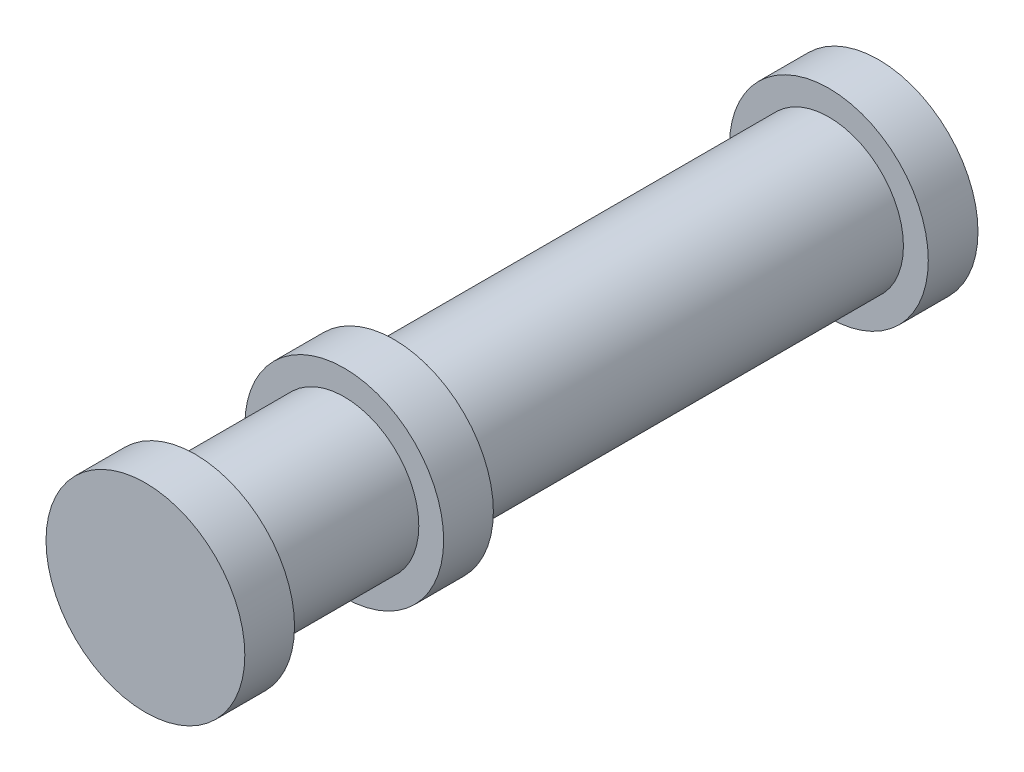
ISO-10303-21;
HEADER;
FILE_DESCRIPTION(('STEP AP214'),'2;1');
FILE_NAME('part.step','',(''),(''),'','','');
FILE_SCHEMA(('AUTOMOTIVE_DESIGN { 1 0 10303 214 1 1 1 1 }'));
ENDSEC;
DATA;
#1=APPLICATION_CONTEXT('core data for automotive mechanical design processes');
#2=APPLICATION_PROTOCOL_DEFINITION('international standard','automotive_design',2000,#1);
#3=PRODUCT_CONTEXT('',#1,'mechanical');
#4=PRODUCT('Part','Part','',(#3));
#5=PRODUCT_RELATED_PRODUCT_CATEGORY('part','',(#4));
#6=PRODUCT_DEFINITION_FORMATION('','',#4);
#7=PRODUCT_DEFINITION_CONTEXT('part definition',#1,'design');
#8=PRODUCT_DEFINITION('design','',#6,#7);
#9=PRODUCT_DEFINITION_SHAPE('','',#8);
#10=(LENGTH_UNIT() NAMED_UNIT(*) SI_UNIT(.MILLI.,.METRE.));
#11=(NAMED_UNIT(*) PLANE_ANGLE_UNIT() SI_UNIT($,.RADIAN.));
#12=(NAMED_UNIT(*) SI_UNIT($,.STERADIAN.) SOLID_ANGLE_UNIT());
#13=UNCERTAINTY_MEASURE_WITH_UNIT(LENGTH_MEASURE(1.E-05),#10,'distance_accuracy_value','');
#14=(GEOMETRIC_REPRESENTATION_CONTEXT(3) GLOBAL_UNCERTAINTY_ASSIGNED_CONTEXT((#13)) GLOBAL_UNIT_ASSIGNED_CONTEXT((#10,
#11,#12)) REPRESENTATION_CONTEXT('',''));
#15=CARTESIAN_POINT('',(0.,0.,0.));
#16=DIRECTION('',(0.,0.,1.));
#17=DIRECTION('',(1.,0.,0.));
#18=AXIS2_PLACEMENT_3D('',#15,#16,#17);
#19=CARTESIAN_POINT('',(0.,0.,39.5));
#20=DIRECTION('',(0.,0.,-1.));
#21=DIRECTION('',(-1.,0.,0.));
#22=AXIS2_PLACEMENT_3D('',#19,#20,#21);
#23=CYLINDRICAL_SURFACE('',#22,3.);
#24=CARTESIAN_POINT('',(0.,0.,19.5));
#25=DIRECTION('',(0.,0.,1.));
#26=DIRECTION('',(1.,0.,0.));
#27=AXIS2_PLACEMENT_3D('',#24,#25,#26);
#28=CIRCLE('',#27,3.);
#29=CARTESIAN_POINT('',(3.,0.,19.5));
#30=VERTEX_POINT('',#29);
#31=EDGE_CURVE('E10',#30,#30,#28,.T.);
#32=ORIENTED_EDGE('',*,*,#31,.T.);
#33=EDGE_LOOP('',(#32));
#34=FACE_BOUND('',#33,.T.);
#35=CARTESIAN_POINT('',(0.,0.,25.5));
#36=DIRECTION('',(0.,0.,1.));
#37=DIRECTION('',(1.,0.,0.));
#38=AXIS2_PLACEMENT_3D('',#35,#36,#37);
#39=CIRCLE('',#38,3.);
#40=CARTESIAN_POINT('',(3.,0.,25.5));
#41=VERTEX_POINT('',#40);
#42=EDGE_CURVE('E40',#41,#41,#39,.T.);
#43=ORIENTED_EDGE('',*,*,#42,.F.);
#44=EDGE_LOOP('',(#43));
#45=FACE_BOUND('',#44,.T.);
#46=ADVANCED_FACE('F36',(#34,#45),#23,.T.);
#47=CARTESIAN_POINT('',(0.,0.,17.5));
#48=DIRECTION('',(0.,0.,-1.));
#49=DIRECTION('',(-1.,0.,0.));
#50=AXIS2_PLACEMENT_3D('',#47,#48,#49);
#51=CYLINDRICAL_SURFACE('',#50,3.);
#52=CARTESIAN_POINT('',(0.,0.,17.5));
#53=DIRECTION('',(0.,0.,1.));
#54=DIRECTION('',(1.,0.,0.));
#55=AXIS2_PLACEMENT_3D('',#52,#53,#54);
#56=CIRCLE('',#55,3.);
#57=CARTESIAN_POINT('',(3.,0.,17.5));
#58=VERTEX_POINT('',#57);
#59=EDGE_CURVE('E44',#58,#58,#56,.T.);
#60=ORIENTED_EDGE('',*,*,#59,.F.);
#61=EDGE_LOOP('',(#60));
#62=FACE_BOUND('',#61,.T.);
#63=CARTESIAN_POINT('',(0.,0.,0.));
#64=DIRECTION('',(0.,0.,1.));
#65=DIRECTION('',(1.,0.,0.));
#66=AXIS2_PLACEMENT_3D('',#63,#64,#65);
#67=CIRCLE('',#66,3.);
#68=CARTESIAN_POINT('',(3.,0.,0.));
#69=VERTEX_POINT('',#68);
#70=EDGE_CURVE('E49',#69,#69,#67,.T.);
#71=ORIENTED_EDGE('',*,*,#70,.T.);
#72=EDGE_LOOP('',(#71));
#73=FACE_BOUND('',#72,.T.);
#74=ADVANCED_FACE('F38',(#62,#73),#51,.T.);
#75=CARTESIAN_POINT('',(0.,0.,-2.));
#76=DIRECTION('',(0.,0.,1.));
#77=DIRECTION('',(1.,0.,0.));
#78=AXIS2_PLACEMENT_3D('',#75,#76,#77);
#79=CYLINDRICAL_SURFACE('',#78,4.);
#80=CARTESIAN_POINT('',(0.,0.,-2.));
#81=DIRECTION('',(0.,0.,-1.));
#82=DIRECTION('',(-1.,0.,0.));
#83=AXIS2_PLACEMENT_3D('',#80,#81,#82);
#84=CIRCLE('',#83,4.);
#85=CARTESIAN_POINT('',(-4.,0.,-2.));
#86=VERTEX_POINT('',#85);
#87=EDGE_CURVE('E62',#86,#86,#84,.T.);
#88=ORIENTED_EDGE('',*,*,#87,.F.);
#89=EDGE_LOOP('',(#88));
#90=FACE_BOUND('',#89,.T.);
#91=CARTESIAN_POINT('',(0.,0.,0.));
#92=DIRECTION('',(0.,0.,-1.));
#93=DIRECTION('',(-1.,0.,0.));
#94=AXIS2_PLACEMENT_3D('',#91,#92,#93);
#95=CIRCLE('',#94,4.);
#96=CARTESIAN_POINT('',(-4.,0.,0.));
#97=VERTEX_POINT('',#96);
#98=EDGE_CURVE('E58',#97,#97,#95,.T.);
#99=ORIENTED_EDGE('',*,*,#98,.T.);
#100=EDGE_LOOP('',(#99));
#101=FACE_BOUND('',#100,.T.);
#102=ADVANCED_FACE('F78',(#90,#101),#79,.T.);
#103=CARTESIAN_POINT('',(0.,0.,-2.));
#104=DIRECTION('',(0.,0.,-1.));
#105=DIRECTION('',(-1.,0.,0.));
#106=AXIS2_PLACEMENT_3D('',#103,#104,#105);
#107=PLANE('',#106);
#108=ORIENTED_EDGE('',*,*,#87,.T.);
#109=EDGE_LOOP('',(#108));
#110=FACE_BOUND('',#109,.T.);
#111=ADVANCED_FACE('F74',(#110),#107,.T.);
#112=CARTESIAN_POINT('',(0.,0.,0.));
#113=DIRECTION('',(0.,0.,-1.));
#114=DIRECTION('',(-1.,0.,0.));
#115=AXIS2_PLACEMENT_3D('',#112,#113,#114);
#116=PLANE('',#115);
#117=ORIENTED_EDGE('',*,*,#70,.F.);
#118=EDGE_LOOP('',(#117));
#119=FACE_BOUND('',#118,.T.);
#120=ORIENTED_EDGE('',*,*,#98,.F.);
#121=EDGE_LOOP('',(#120));
#122=FACE_BOUND('',#121,.T.);
#123=ADVANCED_FACE('F70',(#119,#122),#116,.F.);
#124=CARTESIAN_POINT('',(0.,0.,19.5));
#125=DIRECTION('',(0.,0.,-1.));
#126=DIRECTION('',(-1.,0.,0.));
#127=AXIS2_PLACEMENT_3D('',#124,#125,#126);
#128=CYLINDRICAL_SURFACE('',#127,4.);
#129=CARTESIAN_POINT('',(0.,0.,19.5));
#130=DIRECTION('',(0.,0.,1.));
#131=DIRECTION('',(1.,0.,0.));
#132=AXIS2_PLACEMENT_3D('',#129,#130,#131);
#133=CIRCLE('',#132,4.);
#134=CARTESIAN_POINT('',(4.,0.,19.5));
#135=VERTEX_POINT('',#134);
#136=EDGE_CURVE('E55',#135,#135,#133,.T.);
#137=ORIENTED_EDGE('',*,*,#136,.F.);
#138=EDGE_LOOP('',(#137));
#139=FACE_BOUND('',#138,.T.);
#140=CARTESIAN_POINT('',(0.,0.,17.5));
#141=DIRECTION('',(0.,0.,1.));
#142=DIRECTION('',(1.,0.,0.));
#143=AXIS2_PLACEMENT_3D('',#140,#141,#142);
#144=CIRCLE('',#143,4.);
#145=CARTESIAN_POINT('',(4.,0.,17.5));
#146=VERTEX_POINT('',#145);
#147=EDGE_CURVE('E59',#146,#146,#144,.T.);
#148=ORIENTED_EDGE('',*,*,#147,.T.);
#149=EDGE_LOOP('',(#148));
#150=FACE_BOUND('',#149,.T.);
#151=ADVANCED_FACE('F73',(#139,#150),#128,.T.);
#152=CARTESIAN_POINT('',(0.,0.,19.5));
#153=DIRECTION('',(0.,0.,1.));
#154=DIRECTION('',(1.,0.,0.));
#155=AXIS2_PLACEMENT_3D('',#152,#153,#154);
#156=PLANE('',#155);
#157=ORIENTED_EDGE('',*,*,#31,.F.);
#158=EDGE_LOOP('',(#157));
#159=FACE_BOUND('',#158,.T.);
#160=ORIENTED_EDGE('',*,*,#136,.T.);
#161=EDGE_LOOP('',(#160));
#162=FACE_BOUND('',#161,.T.);
#163=ADVANCED_FACE('F98',(#159,#162),#156,.T.);
#164=CARTESIAN_POINT('',(0.,0.,17.5));
#165=DIRECTION('',(0.,0.,1.));
#166=DIRECTION('',(1.,0.,0.));
#167=AXIS2_PLACEMENT_3D('',#164,#165,#166);
#168=PLANE('',#167);
#169=ORIENTED_EDGE('',*,*,#59,.T.);
#170=EDGE_LOOP('',(#169));
#171=FACE_BOUND('',#170,.T.);
#172=ORIENTED_EDGE('',*,*,#147,.F.);
#173=EDGE_LOOP('',(#172));
#174=FACE_BOUND('',#173,.T.);
#175=ADVANCED_FACE('F101',(#171,#174),#168,.F.);
#176=CARTESIAN_POINT('',(0.,0.,27.5));
#177=DIRECTION('',(0.,0.,-1.));
#178=DIRECTION('',(-1.,0.,0.));
#179=AXIS2_PLACEMENT_3D('',#176,#177,#178);
#180=CYLINDRICAL_SURFACE('',#179,4.);
#181=CARTESIAN_POINT('',(0.,0.,27.5));
#182=DIRECTION('',(0.,0.,1.));
#183=DIRECTION('',(1.,0.,0.));
#184=AXIS2_PLACEMENT_3D('',#181,#182,#183);
#185=CIRCLE('',#184,4.);
#186=CARTESIAN_POINT('',(4.,0.,27.5));
#187=VERTEX_POINT('',#186);
#188=EDGE_CURVE('E212',#187,#187,#185,.T.);
#189=ORIENTED_EDGE('',*,*,#188,.F.);
#190=EDGE_LOOP('',(#189));
#191=FACE_BOUND('',#190,.T.);
#192=CARTESIAN_POINT('',(0.,0.,25.5));
#193=DIRECTION('',(0.,0.,1.));
#194=DIRECTION('',(1.,0.,0.));
#195=AXIS2_PLACEMENT_3D('',#192,#193,#194);
#196=CIRCLE('',#195,4.);
#197=CARTESIAN_POINT('',(4.,0.,25.5));
#198=VERTEX_POINT('',#197);
#199=EDGE_CURVE('E53',#198,#198,#196,.T.);
#200=ORIENTED_EDGE('',*,*,#199,.T.);
#201=EDGE_LOOP('',(#200));
#202=FACE_BOUND('',#201,.T.);
#203=ADVANCED_FACE('F96',(#191,#202),#180,.T.);
#204=CARTESIAN_POINT('',(0.,0.,27.5));
#205=DIRECTION('',(0.,0.,1.));
#206=DIRECTION('',(1.,0.,0.));
#207=AXIS2_PLACEMENT_3D('',#204,#205,#206);
#208=PLANE('',#207);
#209=ORIENTED_EDGE('',*,*,#188,.T.);
#210=EDGE_LOOP('',(#209));
#211=FACE_BOUND('',#210,.T.);
#212=ADVANCED_FACE('F131',(#211),#208,.T.);
#213=CARTESIAN_POINT('',(0.,0.,25.5));
#214=DIRECTION('',(0.,0.,1.));
#215=DIRECTION('',(1.,0.,0.));
#216=AXIS2_PLACEMENT_3D('',#213,#214,#215);
#217=PLANE('',#216);
#218=ORIENTED_EDGE('',*,*,#42,.T.);
#219=EDGE_LOOP('',(#218));
#220=FACE_BOUND('',#219,.T.);
#221=ORIENTED_EDGE('',*,*,#199,.F.);
#222=EDGE_LOOP('',(#221));
#223=FACE_BOUND('',#222,.T.);
#224=ADVANCED_FACE('F138',(#220,#223),#217,.F.);
#225=CLOSED_SHELL('',(#46,#74,#102,#111,#123,#151,#163,#175,#203,#212,#224));
#226=MANIFOLD_SOLID_BREP('B2',#225);
#227=ADVANCED_BREP_SHAPE_REPRESENTATION('',(#18,#226),#14);
#228=SHAPE_DEFINITION_REPRESENTATION(#9,#227);
ENDSEC;
END-ISO-10303-21;
